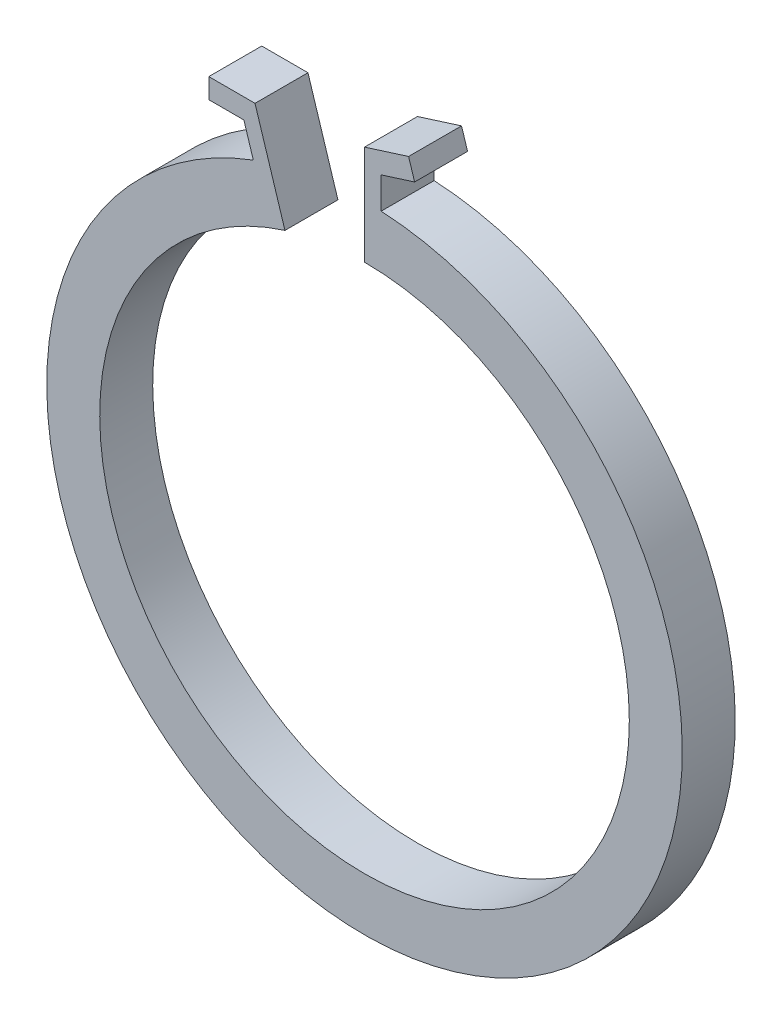
ISO-10303-21;
HEADER;
FILE_DESCRIPTION(('STEP AP214'),'2;1');
FILE_NAME('part.step','',(''),(''),'','','');
FILE_SCHEMA(('AUTOMOTIVE_DESIGN { 1 0 10303 214 1 1 1 1 }'));
ENDSEC;
DATA;
#1=APPLICATION_CONTEXT('core data for automotive mechanical design processes');
#2=APPLICATION_PROTOCOL_DEFINITION('international standard','automotive_design',2000,#1);
#3=PRODUCT_CONTEXT('',#1,'mechanical');
#4=PRODUCT('Part','Part','',(#3));
#5=PRODUCT_RELATED_PRODUCT_CATEGORY('part','',(#4));
#6=PRODUCT_DEFINITION_FORMATION('','',#4);
#7=PRODUCT_DEFINITION_CONTEXT('part definition',#1,'design');
#8=PRODUCT_DEFINITION('design','',#6,#7);
#9=PRODUCT_DEFINITION_SHAPE('','',#8);
#10=(LENGTH_UNIT() NAMED_UNIT(*) SI_UNIT(.MILLI.,.METRE.));
#11=(NAMED_UNIT(*) PLANE_ANGLE_UNIT() SI_UNIT($,.RADIAN.));
#12=(NAMED_UNIT(*) SI_UNIT($,.STERADIAN.) SOLID_ANGLE_UNIT());
#13=UNCERTAINTY_MEASURE_WITH_UNIT(LENGTH_MEASURE(1.E-05),#10,'distance_accuracy_value','');
#14=(GEOMETRIC_REPRESENTATION_CONTEXT(3) GLOBAL_UNCERTAINTY_ASSIGNED_CONTEXT((#13)) GLOBAL_UNIT_ASSIGNED_CONTEXT((#10,
#11,#12)) REPRESENTATION_CONTEXT('',''));
#15=CARTESIAN_POINT('',(0.,0.,0.));
#16=DIRECTION('',(0.,0.,1.));
#17=DIRECTION('',(1.,0.,0.));
#18=AXIS2_PLACEMENT_3D('',#15,#16,#17);
#19=CARTESIAN_POINT('',(0.,0.,1.));
#20=DIRECTION('',(0.,0.,1.));
#21=DIRECTION('',(1.,0.,0.));
#22=AXIS2_PLACEMENT_3D('',#19,#20,#21);
#23=PLANE('',#22);
#24=DIRECTION('',(0.300443490060588,-0.95379961694279,0.));
#25=VECTOR('',#24,1.);
#26=CARTESIAN_POINT('',(-2.79719818028923,8.88009439756843,1.));
#27=LINE('',#26,#25);
#28=CARTESIAN_POINT('',(-2.06791828803558,6.56489401917003,1.));
#29=VERTEX_POINT('',#28);
#30=CARTESIAN_POINT('',(-1.50221745030294,4.76899808471395,1.));
#31=VERTEX_POINT('',#30);
#32=EDGE_CURVE('E230',#29,#31,#27,.T.);
#33=ORIENTED_EDGE('',*,*,#32,.F.);
#34=DIRECTION('',(-0.999999484044671,0.00101582990256522,0.));
#35=VECTOR('',#34,1.);
#36=CARTESIAN_POINT('',(-2.06791828803558,6.56489401917003,1.));
#37=LINE('',#36,#35);
#38=CARTESIAN_POINT('',(-2.94045613456553,6.56578036966297,1.));
#39=VERTEX_POINT('',#38);
#40=EDGE_CURVE('E147',#29,#39,#37,.T.);
#41=ORIENTED_EDGE('',*,*,#40,.T.);
#42=DIRECTION('',(-0.00101582990256554,-0.999999484044671,0.));
#43=VECTOR('',#42,1.);
#44=CARTESIAN_POINT('',(-2.94045613456553,6.56578036966297,1.));
#45=LINE('',#44,#43);
#46=CARTESIAN_POINT('',(-2.94084031808936,6.18758385798222,1.));
#47=VERTEX_POINT('',#46);
#48=EDGE_CURVE('E172',#39,#47,#45,.T.);
#49=ORIENTED_EDGE('',*,*,#48,.T.);
#50=DIRECTION('',(0.999999484044671,-0.00101582990256524,0.));
#51=VECTOR('',#50,1.);
#52=CARTESIAN_POINT('',(-2.94084031808936,6.18758385798222,1.));
#53=LINE('',#52,#51);
#54=CARTESIAN_POINT('',(-2.27811607222991,6.18691064252877,1.));
#55=VERTEX_POINT('',#54);
#56=EDGE_CURVE('E164',#47,#55,#53,.T.);
#57=ORIENTED_EDGE('',*,*,#56,.T.);
#58=DIRECTION('',(0.300443490060554,-0.953799616942801,0.));
#59=VECTOR('',#58,1.);
#60=CARTESIAN_POINT('',(-2.27811607222991,6.18691064252877,1.));
#61=LINE('',#60,#59);
#62=CARTESIAN_POINT('',(-2.09972994617539,5.62059909201273,1.));
#63=VERTEX_POINT('',#62);
#64=EDGE_CURVE('E173',#55,#63,#61,.T.);
#65=ORIENTED_EDGE('',*,*,#64,.T.);
#66=CARTESIAN_POINT('',(0.,0.,1.));
#67=DIRECTION('',(0.,0.,1.));
#68=DIRECTION('',(1.,0.,0.));
#69=AXIS2_PLACEMENT_3D('',#66,#67,#68);
#70=CIRCLE('',#69,6.);
#71=CARTESIAN_POINT('',(0.31404921090976,5.9917754541644,1.));
#72=VERTEX_POINT('',#71);
#73=EDGE_CURVE('E57',#63,#72,#70,.T.);
#74=ORIENTED_EDGE('',*,*,#73,.T.);
#75=DIRECTION('',(0.,1.,0.));
#76=VECTOR('',#75,1.);
#77=CARTESIAN_POINT('',(0.31404921090976,6.58551814440709,1.));
#78=LINE('',#77,#76);
#79=CARTESIAN_POINT('',(0.31404921090976,6.58551814440709,1.));
#80=VERTEX_POINT('',#79);
#81=EDGE_CURVE('E183',#72,#80,#78,.T.);
#82=ORIENTED_EDGE('',*,*,#81,.T.);
#83=DIRECTION('',(0.953493925343549,0.30141223321715,0.));
#84=VECTOR('',#83,1.);
#85=CARTESIAN_POINT('',(0.945953079548803,6.78527144242252,1.));
#86=LINE('',#85,#84);
#87=CARTESIAN_POINT('',(0.945953079548803,6.78527144242252,1.));
#88=VERTEX_POINT('',#87);
#89=EDGE_CURVE('E214',#80,#88,#86,.T.);
#90=ORIENTED_EDGE('',*,*,#89,.T.);
#91=DIRECTION('',(-0.301412233217151,0.953493925343549,0.));
#92=VECTOR('',#91,1.);
#93=CARTESIAN_POINT('',(0.831959965552815,7.145879704954,1.));
#94=LINE('',#93,#92);
#95=CARTESIAN_POINT('',(0.831959965552815,7.145879704954,1.));
#96=VERTEX_POINT('',#95);
#97=EDGE_CURVE('E218',#88,#96,#94,.T.);
#98=ORIENTED_EDGE('',*,*,#97,.T.);
#99=DIRECTION('',(-0.953493925343549,-0.301412233217151,0.));
#100=VECTOR('',#99,1.);
#101=CARTESIAN_POINT('',(0.,6.88288598837191,1.));
#102=LINE('',#101,#100);
#103=CARTESIAN_POINT('',(0.,6.88288598837191,1.));
#104=VERTEX_POINT('',#103);
#105=EDGE_CURVE('E222',#96,#104,#102,.T.);
#106=ORIENTED_EDGE('',*,*,#105,.T.);
#107=DIRECTION('',(0.,1.,0.));
#108=VECTOR('',#107,1.);
#109=CARTESIAN_POINT('',(0.,0.,1.));
#110=LINE('',#109,#108);
#111=CARTESIAN_POINT('',(0.,5.,1.));
#112=VERTEX_POINT('',#111);
#113=EDGE_CURVE('E140',#112,#104,#110,.T.);
#114=ORIENTED_EDGE('',*,*,#113,.F.);
#115=CARTESIAN_POINT('',(0.,0.,1.));
#116=DIRECTION('',(0.,0.,1.));
#117=DIRECTION('',(1.,0.,0.));
#118=AXIS2_PLACEMENT_3D('',#115,#116,#117);
#119=CIRCLE('',#118,5.);
#120=EDGE_CURVE('E254',#31,#112,#119,.T.);
#121=ORIENTED_EDGE('',*,*,#120,.F.);
#122=EDGE_LOOP('',(#33,#41,#49,#57,#65,#74,#82,#90,#98,#106,#114,#121));
#123=FACE_BOUND('',#122,.T.);
#124=ADVANCED_FACE('F39',(#123),#23,.T.);
#125=CARTESIAN_POINT('',(0.,0.,0.));
#126=DIRECTION('',(0.,0.,1.));
#127=DIRECTION('',(1.,0.,0.));
#128=AXIS2_PLACEMENT_3D('',#125,#126,#127);
#129=PLANE('',#128);
#130=CARTESIAN_POINT('',(0.,0.,0.));
#131=DIRECTION('',(0.,0.,1.));
#132=DIRECTION('',(1.,0.,0.));
#133=AXIS2_PLACEMENT_3D('',#130,#131,#132);
#134=CIRCLE('',#133,6.);
#135=CARTESIAN_POINT('',(-2.09972994617539,5.62059909201273,0.));
#136=VERTEX_POINT('',#135);
#137=CARTESIAN_POINT('',(0.31404921090976,5.9917754541644,0.));
#138=VERTEX_POINT('',#137);
#139=EDGE_CURVE('E258',#136,#138,#134,.T.);
#140=ORIENTED_EDGE('',*,*,#139,.F.);
#141=DIRECTION('',(0.300443490060554,-0.953799616942801,0.));
#142=VECTOR('',#141,1.);
#143=CARTESIAN_POINT('',(-2.27811607222991,6.18691064252877,0.));
#144=LINE('',#143,#142);
#145=CARTESIAN_POINT('',(-2.27811607222991,6.18691064252877,0.));
#146=VERTEX_POINT('',#145);
#147=EDGE_CURVE('E157',#146,#136,#144,.T.);
#148=ORIENTED_EDGE('',*,*,#147,.F.);
#149=DIRECTION('',(0.999999484044671,-0.00101582990256524,0.));
#150=VECTOR('',#149,1.);
#151=CARTESIAN_POINT('',(-2.94084031808936,6.18758385798222,0.));
#152=LINE('',#151,#150);
#153=CARTESIAN_POINT('',(-2.94084031808936,6.18758385798222,0.));
#154=VERTEX_POINT('',#153);
#155=EDGE_CURVE('E161',#154,#146,#152,.T.);
#156=ORIENTED_EDGE('',*,*,#155,.F.);
#157=DIRECTION('',(-0.00101582990256554,-0.999999484044671,0.));
#158=VECTOR('',#157,1.);
#159=CARTESIAN_POINT('',(-2.94045613456553,6.56578036966297,0.));
#160=LINE('',#159,#158);
#161=CARTESIAN_POINT('',(-2.94045613456553,6.56578036966297,0.));
#162=VERTEX_POINT('',#161);
#163=EDGE_CURVE('E155',#162,#154,#160,.T.);
#164=ORIENTED_EDGE('',*,*,#163,.F.);
#165=DIRECTION('',(-0.999999484044671,0.00101582990256522,0.));
#166=VECTOR('',#165,1.);
#167=CARTESIAN_POINT('',(-2.06791828803558,6.56489401917003,0.));
#168=LINE('',#167,#166);
#169=CARTESIAN_POINT('',(-2.06791828803558,6.56489401917003,0.));
#170=VERTEX_POINT('',#169);
#171=EDGE_CURVE('E145',#170,#162,#168,.T.);
#172=ORIENTED_EDGE('',*,*,#171,.F.);
#173=DIRECTION('',(0.300443490060588,-0.95379961694279,0.));
#174=VECTOR('',#173,1.);
#175=CARTESIAN_POINT('',(-2.79719818028923,8.88009439756843,0.));
#176=LINE('',#175,#174);
#177=CARTESIAN_POINT('',(-1.50221745030294,4.76899808471395,0.));
#178=VERTEX_POINT('',#177);
#179=EDGE_CURVE('E128',#170,#178,#176,.T.);
#180=ORIENTED_EDGE('',*,*,#179,.T.);
#181=CARTESIAN_POINT('',(0.,0.,0.));
#182=DIRECTION('',(0.,0.,1.));
#183=DIRECTION('',(1.,0.,0.));
#184=AXIS2_PLACEMENT_3D('',#181,#182,#183);
#185=CIRCLE('',#184,5.);
#186=CARTESIAN_POINT('',(0.,5.,0.));
#187=VERTEX_POINT('',#186);
#188=EDGE_CURVE('E259',#178,#187,#185,.T.);
#189=ORIENTED_EDGE('',*,*,#188,.T.);
#190=DIRECTION('',(0.,1.,0.));
#191=VECTOR('',#190,1.);
#192=CARTESIAN_POINT('',(0.,0.,0.));
#193=LINE('',#192,#191);
#194=CARTESIAN_POINT('',(0.,6.88288598837191,0.));
#195=VERTEX_POINT('',#194);
#196=EDGE_CURVE('E139',#187,#195,#193,.T.);
#197=ORIENTED_EDGE('',*,*,#196,.T.);
#198=DIRECTION('',(-0.953493925343549,-0.301412233217151,0.));
#199=VECTOR('',#198,1.);
#200=CARTESIAN_POINT('',(0.,6.88288598837191,0.));
#201=LINE('',#200,#199);
#202=CARTESIAN_POINT('',(0.831959965552815,7.145879704954,0.));
#203=VERTEX_POINT('',#202);
#204=EDGE_CURVE('E209',#203,#195,#201,.T.);
#205=ORIENTED_EDGE('',*,*,#204,.F.);
#206=DIRECTION('',(-0.301412233217151,0.953493925343549,0.));
#207=VECTOR('',#206,1.);
#208=CARTESIAN_POINT('',(0.831959965552815,7.145879704954,0.));
#209=LINE('',#208,#207);
#210=CARTESIAN_POINT('',(0.945953079548803,6.78527144242252,0.));
#211=VERTEX_POINT('',#210);
#212=EDGE_CURVE('E204',#211,#203,#209,.T.);
#213=ORIENTED_EDGE('',*,*,#212,.F.);
#214=DIRECTION('',(0.953493925343549,0.30141223321715,0.));
#215=VECTOR('',#214,1.);
#216=CARTESIAN_POINT('',(0.945953079548803,6.78527144242252,0.));
#217=LINE('',#216,#215);
#218=CARTESIAN_POINT('',(0.31404921090976,6.58551814440709,0.));
#219=VERTEX_POINT('',#218);
#220=EDGE_CURVE('E200',#219,#211,#217,.T.);
#221=ORIENTED_EDGE('',*,*,#220,.F.);
#222=DIRECTION('',(0.,1.,0.));
#223=VECTOR('',#222,1.);
#224=CARTESIAN_POINT('',(0.31404921090976,6.58551814440709,0.));
#225=LINE('',#224,#223);
#226=EDGE_CURVE('E205',#138,#219,#225,.T.);
#227=ORIENTED_EDGE('',*,*,#226,.F.);
#228=EDGE_LOOP('',(#140,#148,#156,#164,#172,#180,#189,#197,#205,#213,#221,#227));
#229=FACE_BOUND('',#228,.T.);
#230=ADVANCED_FACE('F152',(#229),#129,.F.);
#231=CARTESIAN_POINT('',(0.,0.,1.));
#232=DIRECTION('',(0.,0.,-1.));
#233=DIRECTION('',(-1.,0.,0.));
#234=AXIS2_PLACEMENT_3D('',#231,#232,#233);
#235=CYLINDRICAL_SURFACE('',#234,6.);
#236=ORIENTED_EDGE('',*,*,#73,.F.);
#237=DIRECTION('',(0.,0.,1.));
#238=VECTOR('',#237,1.);
#239=CARTESIAN_POINT('',(-2.09972994617545,5.62059909201271,0.));
#240=LINE('',#239,#238);
#241=EDGE_CURVE('E61',#136,#63,#240,.T.);
#242=ORIENTED_EDGE('',*,*,#241,.F.);
#243=ORIENTED_EDGE('',*,*,#139,.T.);
#244=DIRECTION('',(0.,0.,1.));
#245=VECTOR('',#244,1.);
#246=CARTESIAN_POINT('',(0.31404921090976,5.9917754541644,0.));
#247=LINE('',#246,#245);
#248=EDGE_CURVE('E213',#138,#72,#247,.T.);
#249=ORIENTED_EDGE('',*,*,#248,.T.);
#250=EDGE_LOOP('',(#236,#242,#243,#249));
#251=FACE_BOUND('',#250,.T.);
#252=ADVANCED_FACE('F41',(#251),#235,.T.);
#253=CARTESIAN_POINT('',(0.,0.,1.));
#254=DIRECTION('',(0.,0.,-1.));
#255=DIRECTION('',(-1.,0.,0.));
#256=AXIS2_PLACEMENT_3D('',#253,#254,#255);
#257=CYLINDRICAL_SURFACE('',#256,5.);
#258=DIRECTION('',(0.,0.,-1.));
#259=VECTOR('',#258,1.);
#260=CARTESIAN_POINT('',(-1.50221745030294,4.76899808471395,1.));
#261=LINE('',#260,#259);
#262=EDGE_CURVE('E11',#31,#178,#261,.T.);
#263=ORIENTED_EDGE('',*,*,#262,.F.);
#264=ORIENTED_EDGE('',*,*,#120,.T.);
#265=DIRECTION('',(0.,0.,-1.));
#266=VECTOR('',#265,1.);
#267=CARTESIAN_POINT('',(0.,5.,1.));
#268=LINE('',#267,#266);
#269=EDGE_CURVE('E49',#187,#112,#268,.F.);
#270=ORIENTED_EDGE('',*,*,#269,.F.);
#271=ORIENTED_EDGE('',*,*,#188,.F.);
#272=EDGE_LOOP('',(#263,#264,#270,#271));
#273=FACE_BOUND('',#272,.T.);
#274=ADVANCED_FACE('F290',(#273),#257,.F.);
#275=CARTESIAN_POINT('',(0.,0.,0.));
#276=DIRECTION('',(1.,0.,0.));
#277=DIRECTION('',(0.,0.,-1.));
#278=AXIS2_PLACEMENT_3D('',#275,#276,#277);
#279=PLANE('',#278);
#280=ORIENTED_EDGE('',*,*,#196,.F.);
#281=ORIENTED_EDGE('',*,*,#269,.T.);
#282=ORIENTED_EDGE('',*,*,#113,.T.);
#283=DIRECTION('',(0.,0.,1.));
#284=VECTOR('',#283,1.);
#285=CARTESIAN_POINT('',(0.,6.88288598837191,0.));
#286=LINE('',#285,#284);
#287=EDGE_CURVE('E226',#195,#104,#286,.T.);
#288=ORIENTED_EDGE('',*,*,#287,.F.);
#289=EDGE_LOOP('',(#280,#281,#282,#288));
#290=FACE_BOUND('',#289,.T.);
#291=ADVANCED_FACE('F285',(#290),#279,.F.);
#292=CARTESIAN_POINT('',(-2.79719818028923,8.88009439756843,0.));
#293=DIRECTION('',(-0.95379961694279,-0.300443490060588,0.));
#294=DIRECTION('',(0.300443490060588,-0.95379961694279,0.));
#295=AXIS2_PLACEMENT_3D('',#292,#293,#294);
#296=PLANE('',#295);
#297=ORIENTED_EDGE('',*,*,#32,.T.);
#298=ORIENTED_EDGE('',*,*,#262,.T.);
#299=ORIENTED_EDGE('',*,*,#179,.F.);
#300=DIRECTION('',(0.,0.,1.));
#301=VECTOR('',#300,1.);
#302=CARTESIAN_POINT('',(-2.06791828803558,6.56489401917003,0.));
#303=LINE('',#302,#301);
#304=EDGE_CURVE('E131',#170,#29,#303,.T.);
#305=ORIENTED_EDGE('',*,*,#304,.T.);
#306=EDGE_LOOP('',(#297,#298,#299,#305));
#307=FACE_BOUND('',#306,.T.);
#308=ADVANCED_FACE('F130',(#307),#296,.F.);
#309=CARTESIAN_POINT('',(0.,6.88288598837191,0.));
#310=DIRECTION('',(-0.301412233217151,0.953493925343549,0.));
#311=DIRECTION('',(-0.953493925343549,-0.301412233217151,0.));
#312=AXIS2_PLACEMENT_3D('',#309,#310,#311);
#313=PLANE('',#312);
#314=ORIENTED_EDGE('',*,*,#105,.F.);
#315=DIRECTION('',(0.,0.,1.));
#316=VECTOR('',#315,1.);
#317=CARTESIAN_POINT('',(0.831959965552815,7.145879704954,0.));
#318=LINE('',#317,#316);
#319=EDGE_CURVE('E231',#203,#96,#318,.T.);
#320=ORIENTED_EDGE('',*,*,#319,.F.);
#321=ORIENTED_EDGE('',*,*,#204,.T.);
#322=ORIENTED_EDGE('',*,*,#287,.T.);
#323=EDGE_LOOP('',(#314,#320,#321,#322));
#324=FACE_BOUND('',#323,.T.);
#325=ADVANCED_FACE('F294',(#324),#313,.T.);
#326=CARTESIAN_POINT('',(0.831959965552815,7.145879704954,0.));
#327=DIRECTION('',(0.953493925343549,0.301412233217151,0.));
#328=DIRECTION('',(-0.301412233217151,0.953493925343549,0.));
#329=AXIS2_PLACEMENT_3D('',#326,#327,#328);
#330=PLANE('',#329);
#331=ORIENTED_EDGE('',*,*,#97,.F.);
#332=DIRECTION('',(0.,0.,1.));
#333=VECTOR('',#332,1.);
#334=CARTESIAN_POINT('',(0.945953079548803,6.78527144242252,0.));
#335=LINE('',#334,#333);
#336=EDGE_CURVE('E234',#211,#88,#335,.T.);
#337=ORIENTED_EDGE('',*,*,#336,.F.);
#338=ORIENTED_EDGE('',*,*,#212,.T.);
#339=ORIENTED_EDGE('',*,*,#319,.T.);
#340=EDGE_LOOP('',(#331,#337,#338,#339));
#341=FACE_BOUND('',#340,.T.);
#342=ADVANCED_FACE('F297',(#341),#330,.T.);
#343=CARTESIAN_POINT('',(0.945953079548803,6.78527144242252,0.));
#344=DIRECTION('',(0.30141223321715,-0.953493925343549,0.));
#345=DIRECTION('',(0.953493925343549,0.30141223321715,0.));
#346=AXIS2_PLACEMENT_3D('',#343,#344,#345);
#347=PLANE('',#346);
#348=ORIENTED_EDGE('',*,*,#89,.F.);
#349=DIRECTION('',(0.,0.,1.));
#350=VECTOR('',#349,1.);
#351=CARTESIAN_POINT('',(0.31404921090976,6.58551814440709,0.));
#352=LINE('',#351,#350);
#353=EDGE_CURVE('E237',#219,#80,#352,.T.);
#354=ORIENTED_EDGE('',*,*,#353,.F.);
#355=ORIENTED_EDGE('',*,*,#220,.T.);
#356=ORIENTED_EDGE('',*,*,#336,.T.);
#357=EDGE_LOOP('',(#348,#354,#355,#356));
#358=FACE_BOUND('',#357,.T.);
#359=ADVANCED_FACE('F302',(#358),#347,.T.);
#360=CARTESIAN_POINT('',(0.31404921090976,6.58551814440709,0.));
#361=DIRECTION('',(1.,0.,0.));
#362=DIRECTION('',(0.,1.,0.));
#363=AXIS2_PLACEMENT_3D('',#360,#361,#362);
#364=PLANE('',#363);
#365=ORIENTED_EDGE('',*,*,#81,.F.);
#366=ORIENTED_EDGE('',*,*,#248,.F.);
#367=ORIENTED_EDGE('',*,*,#226,.T.);
#368=ORIENTED_EDGE('',*,*,#353,.T.);
#369=EDGE_LOOP('',(#365,#366,#367,#368));
#370=FACE_BOUND('',#369,.T.);
#371=ADVANCED_FACE('F305',(#370),#364,.T.);
#372=CARTESIAN_POINT('',(-2.27811607222991,6.18691064252877,0.));
#373=DIRECTION('',(-0.953799616942801,-0.300443490060554,0.));
#374=DIRECTION('',(0.300443490060554,-0.953799616942801,0.));
#375=AXIS2_PLACEMENT_3D('',#372,#373,#374);
#376=PLANE('',#375);
#377=ORIENTED_EDGE('',*,*,#64,.F.);
#378=DIRECTION('',(0.,0.,1.));
#379=VECTOR('',#378,1.);
#380=CARTESIAN_POINT('',(-2.27811607222991,6.18691064252877,0.));
#381=LINE('',#380,#379);
#382=EDGE_CURVE('E180',#146,#55,#381,.T.);
#383=ORIENTED_EDGE('',*,*,#382,.F.);
#384=ORIENTED_EDGE('',*,*,#147,.T.);
#385=ORIENTED_EDGE('',*,*,#241,.T.);
#386=EDGE_LOOP('',(#377,#383,#384,#385));
#387=FACE_BOUND('',#386,.T.);
#388=ADVANCED_FACE('F311',(#387),#376,.T.);
#389=CARTESIAN_POINT('',(-2.94084031808936,6.18758385798222,0.));
#390=DIRECTION('',(-0.00101582990256524,-0.999999484044671,0.));
#391=DIRECTION('',(0.999999484044671,-0.00101582990256524,0.));
#392=AXIS2_PLACEMENT_3D('',#389,#390,#391);
#393=PLANE('',#392);
#394=ORIENTED_EDGE('',*,*,#56,.F.);
#395=DIRECTION('',(0.,0.,1.));
#396=VECTOR('',#395,1.);
#397=CARTESIAN_POINT('',(-2.94084031808936,6.18758385798222,0.));
#398=LINE('',#397,#396);
#399=EDGE_CURVE('E184',#154,#47,#398,.T.);
#400=ORIENTED_EDGE('',*,*,#399,.F.);
#401=ORIENTED_EDGE('',*,*,#155,.T.);
#402=ORIENTED_EDGE('',*,*,#382,.T.);
#403=EDGE_LOOP('',(#394,#400,#401,#402));
#404=FACE_BOUND('',#403,.T.);
#405=ADVANCED_FACE('F314',(#404),#393,.T.);
#406=CARTESIAN_POINT('',(-2.94045613456553,6.56578036966297,0.));
#407=DIRECTION('',(-0.999999484044671,0.00101582990256554,0.));
#408=DIRECTION('',(-0.00101582990256554,-0.999999484044671,0.));
#409=AXIS2_PLACEMENT_3D('',#406,#407,#408);
#410=PLANE('',#409);
#411=ORIENTED_EDGE('',*,*,#48,.F.);
#412=DIRECTION('',(0.,0.,1.));
#413=VECTOR('',#412,1.);
#414=CARTESIAN_POINT('',(-2.94045613456553,6.56578036966297,0.));
#415=LINE('',#414,#413);
#416=EDGE_CURVE('E149',#162,#39,#415,.T.);
#417=ORIENTED_EDGE('',*,*,#416,.F.);
#418=ORIENTED_EDGE('',*,*,#163,.T.);
#419=ORIENTED_EDGE('',*,*,#399,.T.);
#420=EDGE_LOOP('',(#411,#417,#418,#419));
#421=FACE_BOUND('',#420,.T.);
#422=ADVANCED_FACE('F317',(#421),#410,.T.);
#423=CARTESIAN_POINT('',(-2.06791828803558,6.56489401917003,0.));
#424=DIRECTION('',(0.00101582990256522,0.999999484044671,0.));
#425=DIRECTION('',(-0.999999484044671,0.00101582990256522,0.));
#426=AXIS2_PLACEMENT_3D('',#423,#424,#425);
#427=PLANE('',#426);
#428=ORIENTED_EDGE('',*,*,#40,.F.);
#429=ORIENTED_EDGE('',*,*,#304,.F.);
#430=ORIENTED_EDGE('',*,*,#171,.T.);
#431=ORIENTED_EDGE('',*,*,#416,.T.);
#432=EDGE_LOOP('',(#428,#429,#430,#431));
#433=FACE_BOUND('',#432,.T.);
#434=ADVANCED_FACE('F144',(#433),#427,.T.);
#435=CLOSED_SHELL('',(#124,#230,#252,#274,#291,#308,#325,#342,#359,#371,#388,#405,#422,#434));
#436=MANIFOLD_SOLID_BREP('B2',#435);
#437=ADVANCED_BREP_SHAPE_REPRESENTATION('',(#18,#436),#14);
#438=SHAPE_DEFINITION_REPRESENTATION(#9,#437);
ENDSEC;
END-ISO-10303-21;
